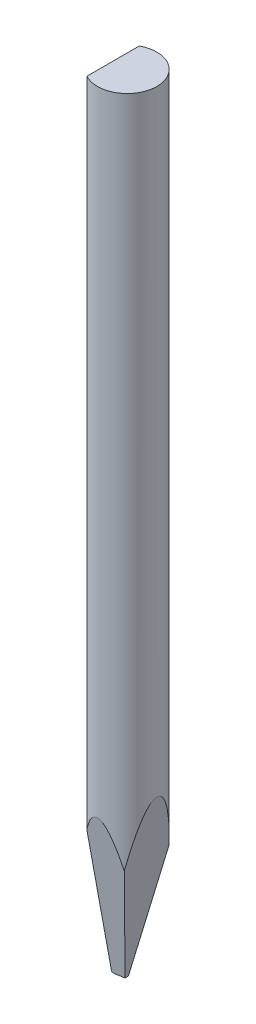
ISO-10303-21;
HEADER;
FILE_DESCRIPTION(('STEP AP214'),'2;1');
FILE_NAME('part.step','',(''),(''),'','','');
FILE_SCHEMA(('AUTOMOTIVE_DESIGN { 1 0 10303 214 1 1 1 1 }'));
ENDSEC;
DATA;
#1=APPLICATION_CONTEXT('core data for automotive mechanical design processes');
#2=APPLICATION_PROTOCOL_DEFINITION('international standard','automotive_design',2000,#1);
#3=PRODUCT_CONTEXT('',#1,'mechanical');
#4=PRODUCT('Part','Part','',(#3));
#5=PRODUCT_RELATED_PRODUCT_CATEGORY('part','',(#4));
#6=PRODUCT_DEFINITION_FORMATION('','',#4);
#7=PRODUCT_DEFINITION_CONTEXT('part definition',#1,'design');
#8=PRODUCT_DEFINITION('design','',#6,#7);
#9=PRODUCT_DEFINITION_SHAPE('','',#8);
#10=(LENGTH_UNIT() NAMED_UNIT(*) SI_UNIT(.MILLI.,.METRE.));
#11=(NAMED_UNIT(*) PLANE_ANGLE_UNIT() SI_UNIT($,.RADIAN.));
#12=(NAMED_UNIT(*) SI_UNIT($,.STERADIAN.) SOLID_ANGLE_UNIT());
#13=UNCERTAINTY_MEASURE_WITH_UNIT(LENGTH_MEASURE(1.E-05),#10,'distance_accuracy_value','');
#14=(GEOMETRIC_REPRESENTATION_CONTEXT(3) GLOBAL_UNCERTAINTY_ASSIGNED_CONTEXT((#13)) GLOBAL_UNIT_ASSIGNED_CONTEXT((#10,
#11,#12)) REPRESENTATION_CONTEXT('',''));
#15=CARTESIAN_POINT('',(0.,0.,0.));
#16=DIRECTION('',(0.,0.,1.));
#17=DIRECTION('',(1.,0.,0.));
#18=AXIS2_PLACEMENT_3D('',#15,#16,#17);
#19=CARTESIAN_POINT('',(26.8344929704266,0.,0.035000057));
#20=DIRECTION('',(0.,-0.180519145250561,0.983571470813386));
#21=DIRECTION('',(0.,-0.983571470813386,-0.180519145250561));
#22=AXIS2_PLACEMENT_3D('',#19,#20,#21);
#23=PLANE('',#22);
#24=CARTESIAN_POINT('',(-0.347661611,0.02794,0.0401280065877724));
#25=DIRECTION('',(0.,-0.180519145250561,0.983571470813386));
#26=DIRECTION('',(0.,-0.983571470813386,-0.180519145250561));
#27=AXIS2_PLACEMENT_3D('',#24,#25,#26);
#28=ELLIPSE('',#27,0.0284066799709984,0.02794);
#29=CARTESIAN_POINT('',(-0.347661611,0.,0.0350000570000015));
#30=VERTEX_POINT('',#29);
#31=CARTESIAN_POINT('',(-0.375500011,0.0255594358987837,0.0396910913157064));
#32=VERTEX_POINT('',#31);
#33=EDGE_CURVE('E56',#30,#32,#28,.F.);
#34=ORIENTED_EDGE('',*,*,#33,.F.);
#35=DIRECTION('',(-1.,0.,0.));
#36=VECTOR('',#35,1.);
#37=CARTESIAN_POINT('',(26.8344929704266,0.,0.035000057));
#38=LINE('',#37,#36);
#39=CARTESIAN_POINT('',(-0.289499929000004,0.,0.0350000569999999));
#40=VERTEX_POINT('',#39);
#41=EDGE_CURVE('E108',#40,#30,#38,.T.);
#42=ORIENTED_EDGE('',*,*,#41,.F.);
#43=DIRECTION('',(-0.984307987911224,-0.173560055595611,-0.0318542310502863));
#44=VECTOR('',#43,1.);
#45=CARTESIAN_POINT('',(25.9899119129686,4.63376934488863,0.885455876683136));
#46=LINE('',#45,#44);
#47=CARTESIAN_POINT('',(-0.0108359627425875,0.0491359758024142,0.0440181961145565));
#48=VERTEX_POINT('',#47);
#49=EDGE_CURVE('E130',#48,#40,#46,.T.);
#50=ORIENTED_EDGE('',*,*,#49,.F.);
#51=DIRECTION('',(-0.170879369159136,-0.96910505965995,-0.177864061960983));
#52=VECTOR('',#51,1.);
#53=CARTESIAN_POINT('',(0.764630155528009,4.44702287407996,0.851181485559263));
#54=LINE('',#53,#52);
#55=CARTESIAN_POINT('',(0.520780283513955,3.06408152821055,0.59736425204236));
#56=VERTEX_POINT('',#55);
#57=EDGE_CURVE('E127',#56,#48,#54,.T.);
#58=ORIENTED_EDGE('',*,*,#57,.F.);
#59=CARTESIAN_POINT('',(0.,-0.190700313223068,0.));
#60=DIRECTION('',(0.,-0.180519145250561,0.983571470813386));
#61=DIRECTION('',(0.,-0.983571470813386,-0.180519145250561));
#62=AXIS2_PLACEMENT_3D('',#59,#60,#61);
#63=ELLIPSE('',#62,4.39011572927631,0.792499939);
#64=CARTESIAN_POINT('',(-0.375500011,3.61182450106666,0.697893899567839));
#65=VERTEX_POINT('',#64);
#66=EDGE_CURVE('E107',#56,#65,#63,.T.);
#67=ORIENTED_EDGE('',*,*,#66,.T.);
#68=DIRECTION('',(0.,0.983571470813386,0.180519145250561));
#69=VECTOR('',#68,1.);
#70=CARTESIAN_POINT('',(-0.375500011,20.1669684788439,3.73633139907856));
#71=LINE('',#70,#69);
#72=EDGE_CURVE('E43',#32,#65,#71,.T.);
#73=ORIENTED_EDGE('',*,*,#72,.F.);
#74=EDGE_LOOP('',(#34,#42,#50,#58,#67,#73));
#75=FACE_BOUND('',#74,.T.);
#76=ADVANCED_FACE('F39',(#75),#23,.T.);
#77=CARTESIAN_POINT('',(26.8344929704266,0.,-0.035000057));
#78=DIRECTION('',(0.,-0.180519145250561,-0.983571470813386));
#79=DIRECTION('',(0.,0.983571470813386,-0.180519145250561));
#80=AXIS2_PLACEMENT_3D('',#77,#78,#79);
#81=PLANE('',#80);
#82=CARTESIAN_POINT('',(-0.347661611,0.02794,-0.0401280065877689));
#83=DIRECTION('',(0.,-0.180519145250561,-0.983571470813386));
#84=DIRECTION('',(0.,0.983571470813386,-0.180519145250561));
#85=AXIS2_PLACEMENT_3D('',#82,#83,#84);
#86=ELLIPSE('',#85,0.0284066799709984,0.02794);
#87=CARTESIAN_POINT('',(-0.375500011,0.0255594358987837,-0.039691091315706));
#88=VERTEX_POINT('',#87);
#89=CARTESIAN_POINT('',(-0.347661611,0.,-0.0350000569999988));
#90=VERTEX_POINT('',#89);
#91=EDGE_CURVE('E11',#88,#90,#86,.F.);
#92=ORIENTED_EDGE('',*,*,#91,.F.);
#93=DIRECTION('',(0.,-0.983571470813386,0.180519145250561));
#94=VECTOR('',#93,1.);
#95=CARTESIAN_POINT('',(-0.375500011,20.4519417874127,-3.78863378849164));
#96=LINE('',#95,#94);
#97=CARTESIAN_POINT('',(-0.375500011,3.61182450106666,-0.697893899567839));
#98=VERTEX_POINT('',#97);
#99=EDGE_CURVE('E154',#98,#88,#96,.T.);
#100=ORIENTED_EDGE('',*,*,#99,.F.);
#101=CARTESIAN_POINT('',(0.,-0.190700313223068,0.));
#102=DIRECTION('',(0.,-0.180519145250561,-0.983571470813386));
#103=DIRECTION('',(0.,-0.983571470813386,0.180519145250561));
#104=AXIS2_PLACEMENT_3D('',#101,#102,#103);
#105=ELLIPSE('',#104,4.39011572927631,0.792499939);
#106=CARTESIAN_POINT('',(0.520780283513955,3.06408152821055,-0.59736425204236));
#107=VERTEX_POINT('',#106);
#108=EDGE_CURVE('E136',#98,#107,#105,.T.);
#109=ORIENTED_EDGE('',*,*,#108,.T.);
#110=DIRECTION('',(0.170879369159136,0.96910505965995,-0.177864061960983));
#111=VECTOR('',#110,1.);
#112=CARTESIAN_POINT('',(0.764630155528009,4.44702287407996,-0.851181485559263));
#113=LINE('',#112,#111);
#114=CARTESIAN_POINT('',(-0.0108359627425875,0.0491359758024142,-0.0440181961145565));
#115=VERTEX_POINT('',#114);
#116=EDGE_CURVE('E151',#115,#107,#113,.T.);
#117=ORIENTED_EDGE('',*,*,#116,.F.);
#118=DIRECTION('',(0.984307987911224,0.173560055595611,-0.0318542310502863));
#119=VECTOR('',#118,1.);
#120=CARTESIAN_POINT('',(25.9899119129686,4.63376934488863,-0.885455876683136));
#121=LINE('',#120,#119);
#122=CARTESIAN_POINT('',(-0.289499929000004,0.,-0.0350000569999999));
#123=VERTEX_POINT('',#122);
#124=EDGE_CURVE('E49',#123,#115,#121,.T.);
#125=ORIENTED_EDGE('',*,*,#124,.F.);
#126=DIRECTION('',(-1.,0.,0.));
#127=VECTOR('',#126,1.);
#128=CARTESIAN_POINT('',(26.8344929704266,0.,-0.035000057));
#129=LINE('',#128,#127);
#130=EDGE_CURVE('E101',#123,#90,#129,.T.);
#131=ORIENTED_EDGE('',*,*,#130,.T.);
#132=EDGE_LOOP('',(#92,#100,#109,#117,#125,#131));
#133=FACE_BOUND('',#132,.T.);
#134=ADVANCED_FACE('F103',(#133),#81,.T.);
#135=CARTESIAN_POINT('',(0.,0.,0.));
#136=DIRECTION('',(0.,1.,0.));
#137=DIRECTION('',(0.,0.,1.));
#138=AXIS2_PLACEMENT_3D('',#135,#136,#137);
#139=PLANE('',#138);
#140=ORIENTED_EDGE('',*,*,#41,.T.);
#141=DIRECTION('',(0.,0.,-1.));
#142=VECTOR('',#141,1.);
#143=CARTESIAN_POINT('',(-0.347661611,0.,26.4088680279266));
#144=LINE('',#143,#142);
#145=EDGE_CURVE('E111',#30,#90,#144,.T.);
#146=ORIENTED_EDGE('',*,*,#145,.T.);
#147=ORIENTED_EDGE('',*,*,#130,.F.);
#148=DIRECTION('',(0.,0.,-1.));
#149=VECTOR('',#148,1.);
#150=CARTESIAN_POINT('',(-0.289499929,0.,27.2374853311364));
#151=LINE('',#150,#149);
#152=EDGE_CURVE('E122',#40,#123,#151,.T.);
#153=ORIENTED_EDGE('',*,*,#152,.F.);
#154=EDGE_LOOP('',(#140,#146,#147,#153));
#155=FACE_BOUND('',#154,.T.);
#156=ADVANCED_FACE('F112',(#155),#139,.F.);
#157=CARTESIAN_POINT('',(0.,20.99999991,0.));
#158=DIRECTION('',(0.,-1.,0.));
#159=DIRECTION('',(0.,0.,-1.));
#160=AXIS2_PLACEMENT_3D('',#157,#158,#159);
#161=CYLINDRICAL_SURFACE('',#160,0.792499939);
#162=ORIENTED_EDGE('',*,*,#66,.F.);
#163=CARTESIAN_POINT('',(0.,0.110589774302554,0.));
#164=DIRECTION('',(-0.984807753012208,0.173648177666931,0.));
#165=DIRECTION('',(-0.173648177666931,-0.984807753012208,0.));
#166=AXIS2_PLACEMENT_3D('',#163,#164,#165);
#167=ELLIPSE('',#166,4.56382525660632,0.792499939);
#168=EDGE_CURVE('E124',#56,#107,#167,.T.);
#169=ORIENTED_EDGE('',*,*,#168,.T.);
#170=ORIENTED_EDGE('',*,*,#108,.F.);
#171=DIRECTION('',(0.,-1.,0.));
#172=VECTOR('',#171,1.);
#173=CARTESIAN_POINT('',(-0.375500011,20.99999991,-0.697893899567838));
#174=LINE('',#173,#172);
#175=CARTESIAN_POINT('',(-0.375500011,20.99999991,-0.697893899567838));
#176=VERTEX_POINT('',#175);
#177=EDGE_CURVE('E142',#176,#98,#174,.T.);
#178=ORIENTED_EDGE('',*,*,#177,.F.);
#179=CARTESIAN_POINT('',(0.,20.99999991,0.));
#180=DIRECTION('',(0.,1.,0.));
#181=DIRECTION('',(0.,0.,1.));
#182=AXIS2_PLACEMENT_3D('',#179,#180,#181);
#183=CIRCLE('',#182,0.792499939);
#184=CARTESIAN_POINT('',(-0.375500011,20.99999991,0.697893899567838));
#185=VERTEX_POINT('',#184);
#186=EDGE_CURVE('E145',#185,#176,#183,.T.);
#187=ORIENTED_EDGE('',*,*,#186,.F.);
#188=DIRECTION('',(0.,-1.,0.));
#189=VECTOR('',#188,1.);
#190=CARTESIAN_POINT('',(-0.375500011,20.99999991,0.697893899567838));
#191=LINE('',#190,#189);
#192=EDGE_CURVE('E140',#65,#185,#191,.F.);
#193=ORIENTED_EDGE('',*,*,#192,.F.);
#194=EDGE_LOOP('',(#162,#169,#170,#178,#187,#193));
#195=FACE_BOUND('',#194,.T.);
#196=ADVANCED_FACE('F41',(#195),#161,.T.);
#197=CARTESIAN_POINT('',(-0.375500011,20.99999991,-0.802499919));
#198=DIRECTION('',(-1.,0.,0.));
#199=DIRECTION('',(0.,0.,1.));
#200=AXIS2_PLACEMENT_3D('',#197,#198,#199);
#201=PLANE('',#200);
#202=ORIENTED_EDGE('',*,*,#99,.T.);
#203=DIRECTION('',(0.,0.,-1.));
#204=VECTOR('',#203,1.);
#205=CARTESIAN_POINT('',(-0.375500011,0.025559435898783,26.4088680279266));
#206=LINE('',#205,#204);
#207=EDGE_CURVE('E64',#32,#88,#206,.T.);
#208=ORIENTED_EDGE('',*,*,#207,.F.);
#209=ORIENTED_EDGE('',*,*,#72,.T.);
#210=ORIENTED_EDGE('',*,*,#192,.T.);
#211=DIRECTION('',(0.,0.,-1.));
#212=VECTOR('',#211,1.);
#213=CARTESIAN_POINT('',(-0.375500011,20.99999991,-0.802499919));
#214=LINE('',#213,#212);
#215=EDGE_CURVE('E138',#185,#176,#214,.T.);
#216=ORIENTED_EDGE('',*,*,#215,.T.);
#217=ORIENTED_EDGE('',*,*,#177,.T.);
#218=EDGE_LOOP('',(#202,#208,#209,#210,#216,#217));
#219=FACE_BOUND('',#218,.T.);
#220=ADVANCED_FACE('F176',(#219),#201,.T.);
#221=CARTESIAN_POINT('',(0.,20.99999991,0.));
#222=DIRECTION('',(0.,1.,0.));
#223=DIRECTION('',(0.,0.,1.));
#224=AXIS2_PLACEMENT_3D('',#221,#222,#223);
#225=PLANE('',#224);
#226=ORIENTED_EDGE('',*,*,#186,.T.);
#227=ORIENTED_EDGE('',*,*,#215,.F.);
#228=EDGE_LOOP('',(#226,#227));
#229=FACE_BOUND('',#228,.T.);
#230=ADVANCED_FACE('F169',(#229),#225,.T.);
#231=CARTESIAN_POINT('',(-0.289499929,0.,27.2374853311364));
#232=DIRECTION('',(-0.173648177666931,0.984807753012208,0.));
#233=DIRECTION('',(-0.984807753012208,-0.173648177666931,0.));
#234=AXIS2_PLACEMENT_3D('',#231,#232,#233);
#235=PLANE('',#234);
#236=DIRECTION('',(0.,0.,-1.));
#237=VECTOR('',#236,1.);
#238=CARTESIAN_POINT('',(-0.0108359627425961,0.0491359758024139,27.2374853311364));
#239=LINE('',#238,#237);
#240=EDGE_CURVE('E117',#48,#115,#239,.T.);
#241=ORIENTED_EDGE('',*,*,#240,.F.);
#242=ORIENTED_EDGE('',*,*,#49,.T.);
#243=ORIENTED_EDGE('',*,*,#152,.T.);
#244=ORIENTED_EDGE('',*,*,#124,.T.);
#245=EDGE_LOOP('',(#241,#242,#243,#244));
#246=FACE_BOUND('',#245,.T.);
#247=ADVANCED_FACE('F167',(#246),#235,.F.);
#248=CARTESIAN_POINT('',(-0.0108359627425961,0.0491359758024139,27.2374853311364));
#249=DIRECTION('',(-0.984807753012208,0.173648177666931,0.));
#250=DIRECTION('',(-0.173648177666931,-0.984807753012208,0.));
#251=AXIS2_PLACEMENT_3D('',#248,#249,#250);
#252=PLANE('',#251);
#253=ORIENTED_EDGE('',*,*,#168,.F.);
#254=ORIENTED_EDGE('',*,*,#57,.T.);
#255=ORIENTED_EDGE('',*,*,#240,.T.);
#256=ORIENTED_EDGE('',*,*,#116,.T.);
#257=EDGE_LOOP('',(#253,#254,#255,#256));
#258=FACE_BOUND('',#257,.T.);
#259=ADVANCED_FACE('F160',(#258),#252,.F.);
#260=CARTESIAN_POINT('',(-0.347661611,0.02794,26.4088680279266));
#261=DIRECTION('',(0.,0.,-1.));
#262=DIRECTION('',(-1.,0.,0.));
#263=AXIS2_PLACEMENT_3D('',#260,#261,#262);
#264=CYLINDRICAL_SURFACE('',#263,0.02794);
#265=ORIENTED_EDGE('',*,*,#145,.F.);
#266=ORIENTED_EDGE('',*,*,#33,.T.);
#267=ORIENTED_EDGE('',*,*,#207,.T.);
#268=ORIENTED_EDGE('',*,*,#91,.T.);
#269=EDGE_LOOP('',(#265,#266,#267,#268));
#270=FACE_BOUND('',#269,.T.);
#271=ADVANCED_FACE('F115',(#270),#264,.T.);
#272=CLOSED_SHELL('',(#76,#134,#156,#196,#220,#230,#247,#259,#271));
#273=MANIFOLD_SOLID_BREP('B2',#272);
#274=ADVANCED_BREP_SHAPE_REPRESENTATION('',(#18,#273),#14);
#275=SHAPE_DEFINITION_REPRESENTATION(#9,#274);
ENDSEC;
END-ISO-10303-21;
